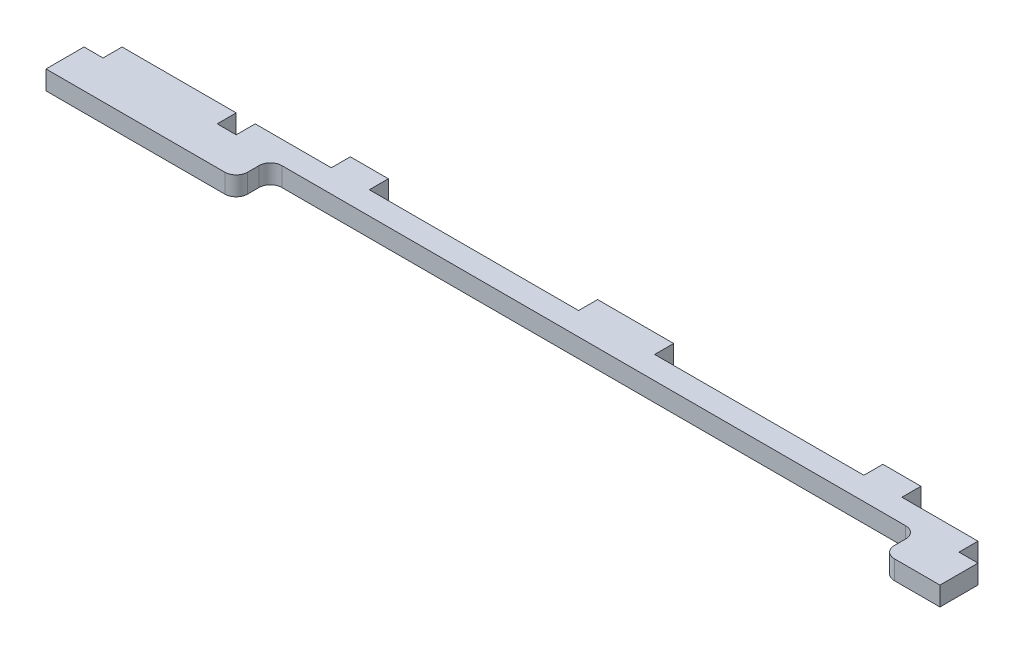
ISO-10303-21;
HEADER;
FILE_DESCRIPTION(('STEP AP214'),'2;1');
FILE_NAME('part.step','',(''),(''),'','','');
FILE_SCHEMA(('AUTOMOTIVE_DESIGN { 1 0 10303 214 1 1 1 1 }'));
ENDSEC;
DATA;
#1=APPLICATION_CONTEXT('core data for automotive mechanical design processes');
#2=APPLICATION_PROTOCOL_DEFINITION('international standard','automotive_design',2000,#1);
#3=PRODUCT_CONTEXT('',#1,'mechanical');
#4=PRODUCT('Part','Part','',(#3));
#5=PRODUCT_RELATED_PRODUCT_CATEGORY('part','',(#4));
#6=PRODUCT_DEFINITION_FORMATION('','',#4);
#7=PRODUCT_DEFINITION_CONTEXT('part definition',#1,'design');
#8=PRODUCT_DEFINITION('design','',#6,#7);
#9=PRODUCT_DEFINITION_SHAPE('','',#8);
#10=(LENGTH_UNIT() NAMED_UNIT(*) SI_UNIT(.MILLI.,.METRE.));
#11=(NAMED_UNIT(*) PLANE_ANGLE_UNIT() SI_UNIT($,.RADIAN.));
#12=(NAMED_UNIT(*) SI_UNIT($,.STERADIAN.) SOLID_ANGLE_UNIT());
#13=UNCERTAINTY_MEASURE_WITH_UNIT(LENGTH_MEASURE(1.E-05),#10,'distance_accuracy_value','');
#14=(GEOMETRIC_REPRESENTATION_CONTEXT(3) GLOBAL_UNCERTAINTY_ASSIGNED_CONTEXT((#13)) GLOBAL_UNIT_ASSIGNED_CONTEXT((#10,
#11,#12)) REPRESENTATION_CONTEXT('',''));
#15=CARTESIAN_POINT('',(0.,0.,0.));
#16=DIRECTION('',(0.,0.,1.));
#17=DIRECTION('',(1.,0.,0.));
#18=AXIS2_PLACEMENT_3D('',#15,#16,#17);
#19=CARTESIAN_POINT('',(170.,5.,-15.));
#20=DIRECTION('',(0.,0.,1.));
#21=DIRECTION('',(1.,0.,0.));
#22=AXIS2_PLACEMENT_3D('',#19,#20,#21);
#23=PLANE('',#22);
#24=DIRECTION('',(-1.,0.,0.));
#25=VECTOR('',#24,1.);
#26=CARTESIAN_POINT('',(170.,0.,-15.));
#27=LINE('',#26,#25);
#28=CARTESIAN_POINT('',(190.,0.,-15.));
#29=VERTEX_POINT('',#28);
#30=CARTESIAN_POINT('',(170.,0.,-15.));
#31=VERTEX_POINT('',#30);
#32=EDGE_CURVE('E275',#29,#31,#27,.T.);
#33=ORIENTED_EDGE('',*,*,#32,.T.);
#34=DIRECTION('',(0.,-1.,0.));
#35=VECTOR('',#34,1.);
#36=CARTESIAN_POINT('',(170.,5.,-15.));
#37=LINE('',#36,#35);
#38=CARTESIAN_POINT('',(170.,5.,-15.));
#39=VERTEX_POINT('',#38);
#40=EDGE_CURVE('E11',#39,#31,#37,.T.);
#41=ORIENTED_EDGE('',*,*,#40,.F.);
#42=DIRECTION('',(-1.,0.,0.));
#43=VECTOR('',#42,1.);
#44=CARTESIAN_POINT('',(170.,5.,-15.));
#45=LINE('',#44,#43);
#46=CARTESIAN_POINT('',(190.,5.,-15.));
#47=VERTEX_POINT('',#46);
#48=EDGE_CURVE('E338',#47,#39,#45,.T.);
#49=ORIENTED_EDGE('',*,*,#48,.F.);
#50=DIRECTION('',(0.,-1.,0.));
#51=VECTOR('',#50,1.);
#52=CARTESIAN_POINT('',(190.,5.,-15.));
#53=LINE('',#52,#51);
#54=EDGE_CURVE('E271',#47,#29,#53,.T.);
#55=ORIENTED_EDGE('',*,*,#54,.T.);
#56=EDGE_LOOP('',(#33,#41,#49,#55));
#57=FACE_BOUND('',#56,.T.);
#58=ADVANCED_FACE('F35',(#57),#23,.F.);
#59=CARTESIAN_POINT('',(170.,5.,-15.));
#60=DIRECTION('',(-1.,0.,0.));
#61=DIRECTION('',(0.,0.,1.));
#62=AXIS2_PLACEMENT_3D('',#59,#60,#61);
#63=PLANE('',#62);
#64=DIRECTION('',(0.,0.,-1.));
#65=VECTOR('',#64,1.);
#66=CARTESIAN_POINT('',(170.,0.,-15.));
#67=LINE('',#66,#65);
#68=CARTESIAN_POINT('',(170.,0.,-20.));
#69=VERTEX_POINT('',#68);
#70=EDGE_CURVE('E278',#31,#69,#67,.T.);
#71=ORIENTED_EDGE('',*,*,#70,.T.);
#72=DIRECTION('',(0.,-1.,0.));
#73=VECTOR('',#72,1.);
#74=CARTESIAN_POINT('',(170.,5.,-20.));
#75=LINE('',#74,#73);
#76=CARTESIAN_POINT('',(170.,5.,-20.));
#77=VERTEX_POINT('',#76);
#78=EDGE_CURVE('E43',#77,#69,#75,.T.);
#79=ORIENTED_EDGE('',*,*,#78,.F.);
#80=DIRECTION('',(0.,0.,-1.));
#81=VECTOR('',#80,1.);
#82=CARTESIAN_POINT('',(170.,5.,-15.));
#83=LINE('',#82,#81);
#84=EDGE_CURVE('E166',#39,#77,#83,.T.);
#85=ORIENTED_EDGE('',*,*,#84,.F.);
#86=ORIENTED_EDGE('',*,*,#40,.T.);
#87=EDGE_LOOP('',(#71,#79,#85,#86));
#88=FACE_BOUND('',#87,.T.);
#89=ADVANCED_FACE('F516',(#88),#63,.F.);
#90=CARTESIAN_POINT('',(160.,5.,-20.));
#91=DIRECTION('',(0.,0.,1.));
#92=DIRECTION('',(1.,0.,0.));
#93=AXIS2_PLACEMENT_3D('',#90,#91,#92);
#94=PLANE('',#93);
#95=DIRECTION('',(-1.,0.,0.));
#96=VECTOR('',#95,1.);
#97=CARTESIAN_POINT('',(160.,0.,-20.));
#98=LINE('',#97,#96);
#99=CARTESIAN_POINT('',(160.,0.,-20.));
#100=VERTEX_POINT('',#99);
#101=EDGE_CURVE('E280',#69,#100,#98,.T.);
#102=ORIENTED_EDGE('',*,*,#101,.T.);
#103=DIRECTION('',(0.,-1.,0.));
#104=VECTOR('',#103,1.);
#105=CARTESIAN_POINT('',(160.,5.,-20.));
#106=LINE('',#105,#104);
#107=CARTESIAN_POINT('',(160.,5.,-20.));
#108=VERTEX_POINT('',#107);
#109=EDGE_CURVE('E417',#108,#100,#106,.T.);
#110=ORIENTED_EDGE('',*,*,#109,.F.);
#111=DIRECTION('',(-1.,0.,0.));
#112=VECTOR('',#111,1.);
#113=CARTESIAN_POINT('',(160.,5.,-20.));
#114=LINE('',#113,#112);
#115=EDGE_CURVE('E425',#77,#108,#114,.T.);
#116=ORIENTED_EDGE('',*,*,#115,.F.);
#117=ORIENTED_EDGE('',*,*,#78,.T.);
#118=EDGE_LOOP('',(#102,#110,#116,#117));
#119=FACE_BOUND('',#118,.T.);
#120=ADVANCED_FACE('F423',(#119),#94,.F.);
#121=CARTESIAN_POINT('',(160.,5.,-15.));
#122=DIRECTION('',(1.,0.,0.));
#123=DIRECTION('',(0.,0.,-1.));
#124=AXIS2_PLACEMENT_3D('',#121,#122,#123);
#125=PLANE('',#124);
#126=DIRECTION('',(0.,0.,1.));
#127=VECTOR('',#126,1.);
#128=CARTESIAN_POINT('',(160.,0.,-15.));
#129=LINE('',#128,#127);
#130=CARTESIAN_POINT('',(160.,0.,-15.));
#131=VERTEX_POINT('',#130);
#132=EDGE_CURVE('E282',#100,#131,#129,.T.);
#133=ORIENTED_EDGE('',*,*,#132,.T.);
#134=DIRECTION('',(0.,-1.,0.));
#135=VECTOR('',#134,1.);
#136=CARTESIAN_POINT('',(160.,5.,-15.));
#137=LINE('',#136,#135);
#138=CARTESIAN_POINT('',(160.,5.,-15.));
#139=VERTEX_POINT('',#138);
#140=EDGE_CURVE('E414',#139,#131,#137,.T.);
#141=ORIENTED_EDGE('',*,*,#140,.F.);
#142=DIRECTION('',(0.,0.,1.));
#143=VECTOR('',#142,1.);
#144=CARTESIAN_POINT('',(160.,5.,-15.));
#145=LINE('',#144,#143);
#146=EDGE_CURVE('E443',#108,#139,#145,.T.);
#147=ORIENTED_EDGE('',*,*,#146,.F.);
#148=ORIENTED_EDGE('',*,*,#109,.T.);
#149=EDGE_LOOP('',(#133,#141,#147,#148));
#150=FACE_BOUND('',#149,.T.);
#151=ADVANCED_FACE('F434',(#150),#125,.F.);
#152=CARTESIAN_POINT('',(105.,5.,-15.));
#153=DIRECTION('',(0.,0.,1.));
#154=DIRECTION('',(1.,0.,0.));
#155=AXIS2_PLACEMENT_3D('',#152,#153,#154);
#156=PLANE('',#155);
#157=DIRECTION('',(-1.,0.,0.));
#158=VECTOR('',#157,1.);
#159=CARTESIAN_POINT('',(105.,0.,-15.));
#160=LINE('',#159,#158);
#161=CARTESIAN_POINT('',(105.,0.,-15.));
#162=VERTEX_POINT('',#161);
#163=EDGE_CURVE('E284',#131,#162,#160,.T.);
#164=ORIENTED_EDGE('',*,*,#163,.T.);
#165=DIRECTION('',(0.,-1.,0.));
#166=VECTOR('',#165,1.);
#167=CARTESIAN_POINT('',(105.,5.,-15.));
#168=LINE('',#167,#166);
#169=CARTESIAN_POINT('',(105.,5.,-15.));
#170=VERTEX_POINT('',#169);
#171=EDGE_CURVE('E411',#170,#162,#168,.T.);
#172=ORIENTED_EDGE('',*,*,#171,.F.);
#173=DIRECTION('',(-1.,0.,0.));
#174=VECTOR('',#173,1.);
#175=CARTESIAN_POINT('',(105.,5.,-15.));
#176=LINE('',#175,#174);
#177=EDGE_CURVE('E440',#139,#170,#176,.T.);
#178=ORIENTED_EDGE('',*,*,#177,.F.);
#179=ORIENTED_EDGE('',*,*,#140,.T.);
#180=EDGE_LOOP('',(#164,#172,#178,#179));
#181=FACE_BOUND('',#180,.T.);
#182=ADVANCED_FACE('F438',(#181),#156,.F.);
#183=CARTESIAN_POINT('',(105.,5.,-15.));
#184=DIRECTION('',(-1.,0.,0.));
#185=DIRECTION('',(0.,0.,1.));
#186=AXIS2_PLACEMENT_3D('',#183,#184,#185);
#187=PLANE('',#186);
#188=DIRECTION('',(0.,0.,-1.));
#189=VECTOR('',#188,1.);
#190=CARTESIAN_POINT('',(105.,0.,-15.));
#191=LINE('',#190,#189);
#192=CARTESIAN_POINT('',(105.,0.,-20.));
#193=VERTEX_POINT('',#192);
#194=EDGE_CURVE('E286',#162,#193,#191,.T.);
#195=ORIENTED_EDGE('',*,*,#194,.T.);
#196=DIRECTION('',(0.,-1.,0.));
#197=VECTOR('',#196,1.);
#198=CARTESIAN_POINT('',(105.,5.,-20.));
#199=LINE('',#198,#197);
#200=CARTESIAN_POINT('',(105.,5.,-20.));
#201=VERTEX_POINT('',#200);
#202=EDGE_CURVE('E408',#201,#193,#199,.T.);
#203=ORIENTED_EDGE('',*,*,#202,.F.);
#204=DIRECTION('',(0.,0.,-1.));
#205=VECTOR('',#204,1.);
#206=CARTESIAN_POINT('',(105.,5.,-15.));
#207=LINE('',#206,#205);
#208=EDGE_CURVE('E442',#170,#201,#207,.T.);
#209=ORIENTED_EDGE('',*,*,#208,.F.);
#210=ORIENTED_EDGE('',*,*,#171,.T.);
#211=EDGE_LOOP('',(#195,#203,#209,#210));
#212=FACE_BOUND('',#211,.T.);
#213=ADVANCED_FACE('F529',(#212),#187,.F.);
#214=CARTESIAN_POINT('',(85.,5.,-20.));
#215=DIRECTION('',(0.,0.,1.));
#216=DIRECTION('',(1.,0.,0.));
#217=AXIS2_PLACEMENT_3D('',#214,#215,#216);
#218=PLANE('',#217);
#219=DIRECTION('',(-1.,0.,0.));
#220=VECTOR('',#219,1.);
#221=CARTESIAN_POINT('',(85.,0.,-20.));
#222=LINE('',#221,#220);
#223=CARTESIAN_POINT('',(85.,0.,-20.));
#224=VERTEX_POINT('',#223);
#225=EDGE_CURVE('E288',#193,#224,#222,.T.);
#226=ORIENTED_EDGE('',*,*,#225,.T.);
#227=DIRECTION('',(0.,-1.,0.));
#228=VECTOR('',#227,1.);
#229=CARTESIAN_POINT('',(85.,5.,-20.));
#230=LINE('',#229,#228);
#231=CARTESIAN_POINT('',(85.,5.,-20.));
#232=VERTEX_POINT('',#231);
#233=EDGE_CURVE('E405',#232,#224,#230,.T.);
#234=ORIENTED_EDGE('',*,*,#233,.F.);
#235=DIRECTION('',(-1.,0.,0.));
#236=VECTOR('',#235,1.);
#237=CARTESIAN_POINT('',(85.,5.,-20.));
#238=LINE('',#237,#236);
#239=EDGE_CURVE('E445',#201,#232,#238,.T.);
#240=ORIENTED_EDGE('',*,*,#239,.F.);
#241=ORIENTED_EDGE('',*,*,#202,.T.);
#242=EDGE_LOOP('',(#226,#234,#240,#241));
#243=FACE_BOUND('',#242,.T.);
#244=ADVANCED_FACE('F532',(#243),#218,.F.);
#245=CARTESIAN_POINT('',(85.,5.,-15.));
#246=DIRECTION('',(1.,0.,0.));
#247=DIRECTION('',(0.,0.,-1.));
#248=AXIS2_PLACEMENT_3D('',#245,#246,#247);
#249=PLANE('',#248);
#250=DIRECTION('',(0.,0.,1.));
#251=VECTOR('',#250,1.);
#252=CARTESIAN_POINT('',(85.,0.,-15.));
#253=LINE('',#252,#251);
#254=CARTESIAN_POINT('',(85.,0.,-15.));
#255=VERTEX_POINT('',#254);
#256=EDGE_CURVE('E290',#224,#255,#253,.T.);
#257=ORIENTED_EDGE('',*,*,#256,.T.);
#258=DIRECTION('',(0.,-1.,0.));
#259=VECTOR('',#258,1.);
#260=CARTESIAN_POINT('',(85.,5.,-15.));
#261=LINE('',#260,#259);
#262=CARTESIAN_POINT('',(85.,5.,-15.));
#263=VERTEX_POINT('',#262);
#264=EDGE_CURVE('E402',#263,#255,#261,.T.);
#265=ORIENTED_EDGE('',*,*,#264,.F.);
#266=DIRECTION('',(0.,0.,1.));
#267=VECTOR('',#266,1.);
#268=CARTESIAN_POINT('',(85.,5.,-15.));
#269=LINE('',#268,#267);
#270=EDGE_CURVE('E451',#232,#263,#269,.T.);
#271=ORIENTED_EDGE('',*,*,#270,.F.);
#272=ORIENTED_EDGE('',*,*,#233,.T.);
#273=EDGE_LOOP('',(#257,#265,#271,#272));
#274=FACE_BOUND('',#273,.T.);
#275=ADVANCED_FACE('F536',(#274),#249,.F.);
#276=CARTESIAN_POINT('',(30.,5.,-15.));
#277=DIRECTION('',(0.,0.,1.));
#278=DIRECTION('',(1.,0.,0.));
#279=AXIS2_PLACEMENT_3D('',#276,#277,#278);
#280=PLANE('',#279);
#281=DIRECTION('',(-1.,0.,0.));
#282=VECTOR('',#281,1.);
#283=CARTESIAN_POINT('',(30.,0.,-15.));
#284=LINE('',#283,#282);
#285=CARTESIAN_POINT('',(30.,0.,-15.));
#286=VERTEX_POINT('',#285);
#287=EDGE_CURVE('E292',#255,#286,#284,.T.);
#288=ORIENTED_EDGE('',*,*,#287,.T.);
#289=DIRECTION('',(0.,-1.,0.));
#290=VECTOR('',#289,1.);
#291=CARTESIAN_POINT('',(30.,5.,-15.));
#292=LINE('',#291,#290);
#293=CARTESIAN_POINT('',(30.,5.,-15.));
#294=VERTEX_POINT('',#293);
#295=EDGE_CURVE('E399',#294,#286,#292,.T.);
#296=ORIENTED_EDGE('',*,*,#295,.F.);
#297=DIRECTION('',(-1.,0.,0.));
#298=VECTOR('',#297,1.);
#299=CARTESIAN_POINT('',(30.,5.,-15.));
#300=LINE('',#299,#298);
#301=EDGE_CURVE('E453',#263,#294,#300,.T.);
#302=ORIENTED_EDGE('',*,*,#301,.F.);
#303=ORIENTED_EDGE('',*,*,#264,.T.);
#304=EDGE_LOOP('',(#288,#296,#302,#303));
#305=FACE_BOUND('',#304,.T.);
#306=ADVANCED_FACE('F540',(#305),#280,.F.);
#307=CARTESIAN_POINT('',(30.,5.,-15.));
#308=DIRECTION('',(-1.,0.,0.));
#309=DIRECTION('',(0.,0.,1.));
#310=AXIS2_PLACEMENT_3D('',#307,#308,#309);
#311=PLANE('',#310);
#312=DIRECTION('',(0.,0.,-1.));
#313=VECTOR('',#312,1.);
#314=CARTESIAN_POINT('',(30.,0.,-15.));
#315=LINE('',#314,#313);
#316=CARTESIAN_POINT('',(30.,0.,-20.));
#317=VERTEX_POINT('',#316);
#318=EDGE_CURVE('E294',#286,#317,#315,.T.);
#319=ORIENTED_EDGE('',*,*,#318,.T.);
#320=DIRECTION('',(0.,-1.,0.));
#321=VECTOR('',#320,1.);
#322=CARTESIAN_POINT('',(30.,5.,-20.));
#323=LINE('',#322,#321);
#324=CARTESIAN_POINT('',(30.,5.,-20.));
#325=VERTEX_POINT('',#324);
#326=EDGE_CURVE('E396',#325,#317,#323,.T.);
#327=ORIENTED_EDGE('',*,*,#326,.F.);
#328=DIRECTION('',(0.,0.,-1.));
#329=VECTOR('',#328,1.);
#330=CARTESIAN_POINT('',(30.,5.,-15.));
#331=LINE('',#330,#329);
#332=EDGE_CURVE('E455',#294,#325,#331,.T.);
#333=ORIENTED_EDGE('',*,*,#332,.F.);
#334=ORIENTED_EDGE('',*,*,#295,.T.);
#335=EDGE_LOOP('',(#319,#327,#333,#334));
#336=FACE_BOUND('',#335,.T.);
#337=ADVANCED_FACE('F544',(#336),#311,.F.);
#338=CARTESIAN_POINT('',(20.,5.,-20.));
#339=DIRECTION('',(0.,0.,1.));
#340=DIRECTION('',(1.,0.,0.));
#341=AXIS2_PLACEMENT_3D('',#338,#339,#340);
#342=PLANE('',#341);
#343=DIRECTION('',(-1.,0.,0.));
#344=VECTOR('',#343,1.);
#345=CARTESIAN_POINT('',(20.,0.,-20.));
#346=LINE('',#345,#344);
#347=CARTESIAN_POINT('',(20.,0.,-20.));
#348=VERTEX_POINT('',#347);
#349=EDGE_CURVE('E296',#317,#348,#346,.T.);
#350=ORIENTED_EDGE('',*,*,#349,.T.);
#351=DIRECTION('',(0.,-1.,0.));
#352=VECTOR('',#351,1.);
#353=CARTESIAN_POINT('',(20.,5.,-20.));
#354=LINE('',#353,#352);
#355=CARTESIAN_POINT('',(20.,5.,-20.));
#356=VERTEX_POINT('',#355);
#357=EDGE_CURVE('E393',#356,#348,#354,.T.);
#358=ORIENTED_EDGE('',*,*,#357,.F.);
#359=DIRECTION('',(-1.,0.,0.));
#360=VECTOR('',#359,1.);
#361=CARTESIAN_POINT('',(20.,5.,-20.));
#362=LINE('',#361,#360);
#363=EDGE_CURVE('E457',#325,#356,#362,.T.);
#364=ORIENTED_EDGE('',*,*,#363,.F.);
#365=ORIENTED_EDGE('',*,*,#326,.T.);
#366=EDGE_LOOP('',(#350,#358,#364,#365));
#367=FACE_BOUND('',#366,.T.);
#368=ADVANCED_FACE('F548',(#367),#342,.F.);
#369=CARTESIAN_POINT('',(20.,5.,-15.));
#370=DIRECTION('',(1.,0.,0.));
#371=DIRECTION('',(0.,0.,-1.));
#372=AXIS2_PLACEMENT_3D('',#369,#370,#371);
#373=PLANE('',#372);
#374=DIRECTION('',(0.,0.,1.));
#375=VECTOR('',#374,1.);
#376=CARTESIAN_POINT('',(20.,0.,-15.));
#377=LINE('',#376,#375);
#378=CARTESIAN_POINT('',(20.,0.,-15.));
#379=VERTEX_POINT('',#378);
#380=EDGE_CURVE('E298',#348,#379,#377,.T.);
#381=ORIENTED_EDGE('',*,*,#380,.T.);
#382=DIRECTION('',(0.,-1.,0.));
#383=VECTOR('',#382,1.);
#384=CARTESIAN_POINT('',(20.,5.,-15.));
#385=LINE('',#384,#383);
#386=CARTESIAN_POINT('',(20.,5.,-15.));
#387=VERTEX_POINT('',#386);
#388=EDGE_CURVE('E390',#387,#379,#385,.T.);
#389=ORIENTED_EDGE('',*,*,#388,.F.);
#390=DIRECTION('',(0.,0.,1.));
#391=VECTOR('',#390,1.);
#392=CARTESIAN_POINT('',(20.,5.,-15.));
#393=LINE('',#392,#391);
#394=EDGE_CURVE('E459',#356,#387,#393,.T.);
#395=ORIENTED_EDGE('',*,*,#394,.F.);
#396=ORIENTED_EDGE('',*,*,#357,.T.);
#397=EDGE_LOOP('',(#381,#389,#395,#396));
#398=FACE_BOUND('',#397,.T.);
#399=ADVANCED_FACE('F552',(#398),#373,.F.);
#400=CARTESIAN_POINT('',(0.,5.,-15.));
#401=DIRECTION('',(0.,0.,1.));
#402=DIRECTION('',(1.,0.,0.));
#403=AXIS2_PLACEMENT_3D('',#400,#401,#402);
#404=PLANE('',#403);
#405=DIRECTION('',(-1.,0.,0.));
#406=VECTOR('',#405,1.);
#407=CARTESIAN_POINT('',(0.,0.,-15.));
#408=LINE('',#407,#406);
#409=CARTESIAN_POINT('',(0.,0.,-15.));
#410=VERTEX_POINT('',#409);
#411=EDGE_CURVE('E300',#379,#410,#408,.T.);
#412=ORIENTED_EDGE('',*,*,#411,.T.);
#413=DIRECTION('',(0.,-1.,0.));
#414=VECTOR('',#413,1.);
#415=CARTESIAN_POINT('',(0.,5.,-15.));
#416=LINE('',#415,#414);
#417=CARTESIAN_POINT('',(0.,5.,-15.));
#418=VERTEX_POINT('',#417);
#419=EDGE_CURVE('E387',#418,#410,#416,.T.);
#420=ORIENTED_EDGE('',*,*,#419,.F.);
#421=DIRECTION('',(-1.,0.,0.));
#422=VECTOR('',#421,1.);
#423=CARTESIAN_POINT('',(0.,5.,-15.));
#424=LINE('',#423,#422);
#425=EDGE_CURVE('E461',#387,#418,#424,.T.);
#426=ORIENTED_EDGE('',*,*,#425,.F.);
#427=ORIENTED_EDGE('',*,*,#388,.T.);
#428=EDGE_LOOP('',(#412,#420,#426,#427));
#429=FACE_BOUND('',#428,.T.);
#430=ADVANCED_FACE('F556',(#429),#404,.F.);
#431=CARTESIAN_POINT('',(0.,5.,-10.));
#432=DIRECTION('',(1.,0.,0.));
#433=DIRECTION('',(0.,0.,-1.));
#434=AXIS2_PLACEMENT_3D('',#431,#432,#433);
#435=PLANE('',#434);
#436=DIRECTION('',(0.,0.,1.));
#437=VECTOR('',#436,1.);
#438=CARTESIAN_POINT('',(0.,0.,-10.));
#439=LINE('',#438,#437);
#440=CARTESIAN_POINT('',(0.,0.,-10.));
#441=VERTEX_POINT('',#440);
#442=EDGE_CURVE('E302',#410,#441,#439,.T.);
#443=ORIENTED_EDGE('',*,*,#442,.T.);
#444=DIRECTION('',(0.,-1.,0.));
#445=VECTOR('',#444,1.);
#446=CARTESIAN_POINT('',(0.,5.,-10.));
#447=LINE('',#446,#445);
#448=CARTESIAN_POINT('',(0.,5.,-10.));
#449=VERTEX_POINT('',#448);
#450=EDGE_CURVE('E384',#449,#441,#447,.T.);
#451=ORIENTED_EDGE('',*,*,#450,.F.);
#452=DIRECTION('',(0.,0.,1.));
#453=VECTOR('',#452,1.);
#454=CARTESIAN_POINT('',(0.,5.,-10.));
#455=LINE('',#454,#453);
#456=EDGE_CURVE('E463',#418,#449,#455,.T.);
#457=ORIENTED_EDGE('',*,*,#456,.F.);
#458=ORIENTED_EDGE('',*,*,#419,.T.);
#459=EDGE_LOOP('',(#443,#451,#457,#458));
#460=FACE_BOUND('',#459,.T.);
#461=ADVANCED_FACE('F560',(#460),#435,.F.);
#462=CARTESIAN_POINT('',(0.,5.,-10.));
#463=DIRECTION('',(0.,0.,1.));
#464=DIRECTION('',(1.,0.,0.));
#465=AXIS2_PLACEMENT_3D('',#462,#463,#464);
#466=PLANE('',#465);
#467=DIRECTION('',(-1.,0.,0.));
#468=VECTOR('',#467,1.);
#469=CARTESIAN_POINT('',(0.,0.,-10.));
#470=LINE('',#469,#468);
#471=CARTESIAN_POINT('',(-5.,0.,-10.));
#472=VERTEX_POINT('',#471);
#473=EDGE_CURVE('E304',#441,#472,#470,.T.);
#474=ORIENTED_EDGE('',*,*,#473,.T.);
#475=DIRECTION('',(0.,-1.,0.));
#476=VECTOR('',#475,1.);
#477=CARTESIAN_POINT('',(-5.,5.,-10.));
#478=LINE('',#477,#476);
#479=CARTESIAN_POINT('',(-5.,5.,-10.));
#480=VERTEX_POINT('',#479);
#481=EDGE_CURVE('E381',#480,#472,#478,.T.);
#482=ORIENTED_EDGE('',*,*,#481,.F.);
#483=DIRECTION('',(-1.,0.,0.));
#484=VECTOR('',#483,1.);
#485=CARTESIAN_POINT('',(0.,5.,-10.));
#486=LINE('',#485,#484);
#487=EDGE_CURVE('E465',#449,#480,#486,.T.);
#488=ORIENTED_EDGE('',*,*,#487,.F.);
#489=ORIENTED_EDGE('',*,*,#450,.T.);
#490=EDGE_LOOP('',(#474,#482,#488,#489));
#491=FACE_BOUND('',#490,.T.);
#492=ADVANCED_FACE('F564',(#491),#466,.F.);
#493=CARTESIAN_POINT('',(-5.,5.,-15.));
#494=DIRECTION('',(-1.,0.,0.));
#495=DIRECTION('',(0.,0.,1.));
#496=AXIS2_PLACEMENT_3D('',#493,#494,#495);
#497=PLANE('',#496);
#498=DIRECTION('',(0.,0.,-1.));
#499=VECTOR('',#498,1.);
#500=CARTESIAN_POINT('',(-5.,0.,-15.));
#501=LINE('',#500,#499);
#502=CARTESIAN_POINT('',(-5.,0.,-15.));
#503=VERTEX_POINT('',#502);
#504=EDGE_CURVE('E306',#472,#503,#501,.T.);
#505=ORIENTED_EDGE('',*,*,#504,.T.);
#506=DIRECTION('',(0.,-1.,0.));
#507=VECTOR('',#506,1.);
#508=CARTESIAN_POINT('',(-5.,5.,-15.));
#509=LINE('',#508,#507);
#510=CARTESIAN_POINT('',(-5.,5.,-15.));
#511=VERTEX_POINT('',#510);
#512=EDGE_CURVE('E378',#511,#503,#509,.T.);
#513=ORIENTED_EDGE('',*,*,#512,.F.);
#514=DIRECTION('',(0.,0.,-1.));
#515=VECTOR('',#514,1.);
#516=CARTESIAN_POINT('',(-5.,5.,-15.));
#517=LINE('',#516,#515);
#518=EDGE_CURVE('E467',#480,#511,#517,.T.);
#519=ORIENTED_EDGE('',*,*,#518,.F.);
#520=ORIENTED_EDGE('',*,*,#481,.T.);
#521=EDGE_LOOP('',(#505,#513,#519,#520));
#522=FACE_BOUND('',#521,.T.);
#523=ADVANCED_FACE('F568',(#522),#497,.F.);
#524=CARTESIAN_POINT('',(-35.,5.,-15.));
#525=DIRECTION('',(0.,0.,1.));
#526=DIRECTION('',(1.,0.,0.));
#527=AXIS2_PLACEMENT_3D('',#524,#525,#526);
#528=PLANE('',#527);
#529=DIRECTION('',(-1.,0.,0.));
#530=VECTOR('',#529,1.);
#531=CARTESIAN_POINT('',(-35.,0.,-15.));
#532=LINE('',#531,#530);
#533=CARTESIAN_POINT('',(-35.,0.,-15.));
#534=VERTEX_POINT('',#533);
#535=EDGE_CURVE('E308',#503,#534,#532,.T.);
#536=ORIENTED_EDGE('',*,*,#535,.T.);
#537=DIRECTION('',(0.,-1.,0.));
#538=VECTOR('',#537,1.);
#539=CARTESIAN_POINT('',(-35.,5.,-15.));
#540=LINE('',#539,#538);
#541=CARTESIAN_POINT('',(-35.,5.,-15.));
#542=VERTEX_POINT('',#541);
#543=EDGE_CURVE('E375',#542,#534,#540,.T.);
#544=ORIENTED_EDGE('',*,*,#543,.F.);
#545=DIRECTION('',(-1.,0.,0.));
#546=VECTOR('',#545,1.);
#547=CARTESIAN_POINT('',(-35.,5.,-15.));
#548=LINE('',#547,#546);
#549=EDGE_CURVE('E469',#511,#542,#548,.T.);
#550=ORIENTED_EDGE('',*,*,#549,.F.);
#551=ORIENTED_EDGE('',*,*,#512,.T.);
#552=EDGE_LOOP('',(#536,#544,#550,#551));
#553=FACE_BOUND('',#552,.T.);
#554=ADVANCED_FACE('F572',(#553),#528,.F.);
#555=CARTESIAN_POINT('',(-35.,5.,-10.));
#556=DIRECTION('',(1.,0.,0.));
#557=DIRECTION('',(0.,0.,-1.));
#558=AXIS2_PLACEMENT_3D('',#555,#556,#557);
#559=PLANE('',#558);
#560=DIRECTION('',(0.,0.,1.));
#561=VECTOR('',#560,1.);
#562=CARTESIAN_POINT('',(-35.,0.,-10.));
#563=LINE('',#562,#561);
#564=CARTESIAN_POINT('',(-35.,0.,-10.));
#565=VERTEX_POINT('',#564);
#566=EDGE_CURVE('E310',#534,#565,#563,.T.);
#567=ORIENTED_EDGE('',*,*,#566,.T.);
#568=DIRECTION('',(0.,-1.,0.));
#569=VECTOR('',#568,1.);
#570=CARTESIAN_POINT('',(-35.,5.,-10.));
#571=LINE('',#570,#569);
#572=CARTESIAN_POINT('',(-35.,5.,-10.));
#573=VERTEX_POINT('',#572);
#574=EDGE_CURVE('E372',#573,#565,#571,.T.);
#575=ORIENTED_EDGE('',*,*,#574,.F.);
#576=DIRECTION('',(0.,0.,1.));
#577=VECTOR('',#576,1.);
#578=CARTESIAN_POINT('',(-35.,5.,-10.));
#579=LINE('',#578,#577);
#580=EDGE_CURVE('E471',#542,#573,#579,.T.);
#581=ORIENTED_EDGE('',*,*,#580,.F.);
#582=ORIENTED_EDGE('',*,*,#543,.T.);
#583=EDGE_LOOP('',(#567,#575,#581,#582));
#584=FACE_BOUND('',#583,.T.);
#585=ADVANCED_FACE('F576',(#584),#559,.F.);
#586=CARTESIAN_POINT('',(-40.,5.,-10.));
#587=DIRECTION('',(0.,0.,1.));
#588=DIRECTION('',(1.,0.,0.));
#589=AXIS2_PLACEMENT_3D('',#586,#587,#588);
#590=PLANE('',#589);
#591=DIRECTION('',(-1.,0.,0.));
#592=VECTOR('',#591,1.);
#593=CARTESIAN_POINT('',(-40.,0.,-10.));
#594=LINE('',#593,#592);
#595=CARTESIAN_POINT('',(-40.,0.,-10.));
#596=VERTEX_POINT('',#595);
#597=EDGE_CURVE('E312',#565,#596,#594,.T.);
#598=ORIENTED_EDGE('',*,*,#597,.T.);
#599=DIRECTION('',(0.,-1.,0.));
#600=VECTOR('',#599,1.);
#601=CARTESIAN_POINT('',(-40.,5.,-10.));
#602=LINE('',#601,#600);
#603=CARTESIAN_POINT('',(-40.,5.,-10.));
#604=VERTEX_POINT('',#603);
#605=EDGE_CURVE('E369',#604,#596,#602,.T.);
#606=ORIENTED_EDGE('',*,*,#605,.F.);
#607=DIRECTION('',(-1.,0.,0.));
#608=VECTOR('',#607,1.);
#609=CARTESIAN_POINT('',(-40.,5.,-10.));
#610=LINE('',#609,#608);
#611=EDGE_CURVE('E473',#573,#604,#610,.T.);
#612=ORIENTED_EDGE('',*,*,#611,.F.);
#613=ORIENTED_EDGE('',*,*,#574,.T.);
#614=EDGE_LOOP('',(#598,#606,#612,#613));
#615=FACE_BOUND('',#614,.T.);
#616=ADVANCED_FACE('F580',(#615),#590,.F.);
#617=CARTESIAN_POINT('',(-40.,5.,0.));
#618=DIRECTION('',(1.,0.,0.));
#619=DIRECTION('',(0.,0.,-1.));
#620=AXIS2_PLACEMENT_3D('',#617,#618,#619);
#621=PLANE('',#620);
#622=DIRECTION('',(0.,0.,1.));
#623=VECTOR('',#622,1.);
#624=CARTESIAN_POINT('',(-40.,0.,0.));
#625=LINE('',#624,#623);
#626=CARTESIAN_POINT('',(-40.,0.,0.));
#627=VERTEX_POINT('',#626);
#628=EDGE_CURVE('E314',#596,#627,#625,.T.);
#629=ORIENTED_EDGE('',*,*,#628,.T.);
#630=DIRECTION('',(0.,-1.,0.));
#631=VECTOR('',#630,1.);
#632=CARTESIAN_POINT('',(-40.,5.,0.));
#633=LINE('',#632,#631);
#634=CARTESIAN_POINT('',(-40.,5.,0.));
#635=VERTEX_POINT('',#634);
#636=EDGE_CURVE('E366',#635,#627,#633,.T.);
#637=ORIENTED_EDGE('',*,*,#636,.F.);
#638=DIRECTION('',(0.,0.,1.));
#639=VECTOR('',#638,1.);
#640=CARTESIAN_POINT('',(-40.,5.,0.));
#641=LINE('',#640,#639);
#642=EDGE_CURVE('E475',#604,#635,#641,.T.);
#643=ORIENTED_EDGE('',*,*,#642,.F.);
#644=ORIENTED_EDGE('',*,*,#605,.T.);
#645=EDGE_LOOP('',(#629,#637,#643,#644));
#646=FACE_BOUND('',#645,.T.);
#647=ADVANCED_FACE('F584',(#646),#621,.F.);
#648=CARTESIAN_POINT('',(-5.,5.,0.));
#649=DIRECTION('',(0.,0.,-1.));
#650=DIRECTION('',(-1.,0.,0.));
#651=AXIS2_PLACEMENT_3D('',#648,#649,#650);
#652=PLANE('',#651);
#653=DIRECTION('',(1.,0.,0.));
#654=VECTOR('',#653,1.);
#655=CARTESIAN_POINT('',(-5.,0.,0.));
#656=LINE('',#655,#654);
#657=CARTESIAN_POINT('',(6.99999999999998,0.,0.));
#658=VERTEX_POINT('',#657);
#659=EDGE_CURVE('E317',#627,#658,#656,.T.);
#660=ORIENTED_EDGE('',*,*,#659,.T.);
#661=DIRECTION('',(0.,-1.,0.));
#662=VECTOR('',#661,1.);
#663=CARTESIAN_POINT('',(6.99999999999998,5.,0.));
#664=LINE('',#663,#662);
#665=CARTESIAN_POINT('',(6.99999999999998,5.,0.));
#666=VERTEX_POINT('',#665);
#667=EDGE_CURVE('E363',#666,#658,#664,.T.);
#668=ORIENTED_EDGE('',*,*,#667,.F.);
#669=DIRECTION('',(1.,0.,0.));
#670=VECTOR('',#669,1.);
#671=CARTESIAN_POINT('',(-5.,5.,0.));
#672=LINE('',#671,#670);
#673=EDGE_CURVE('E477',#635,#666,#672,.T.);
#674=ORIENTED_EDGE('',*,*,#673,.F.);
#675=ORIENTED_EDGE('',*,*,#636,.T.);
#676=EDGE_LOOP('',(#660,#668,#674,#675));
#677=FACE_BOUND('',#676,.T.);
#678=ADVANCED_FACE('F588',(#677),#652,.F.);
#679=CARTESIAN_POINT('',(7.,5.,-3.));
#680=DIRECTION('',(0.,-1.,0.));
#681=DIRECTION('',(0.,0.,-1.));
#682=AXIS2_PLACEMENT_3D('',#679,#680,#681);
#683=CYLINDRICAL_SURFACE('',#682,3.);
#684=CARTESIAN_POINT('',(7.,0.,-3.));
#685=DIRECTION('',(0.,1.,0.));
#686=DIRECTION('',(0.,0.,-1.));
#687=AXIS2_PLACEMENT_3D('',#684,#685,#686);
#688=CIRCLE('',#687,3.);
#689=CARTESIAN_POINT('',(10.,0.,-3.00000000000002));
#690=VERTEX_POINT('',#689);
#691=EDGE_CURVE('E319',#658,#690,#688,.T.);
#692=ORIENTED_EDGE('',*,*,#691,.T.);
#693=DIRECTION('',(0.,-1.,0.));
#694=VECTOR('',#693,1.);
#695=CARTESIAN_POINT('',(10.,5.,-3.00000000000002));
#696=LINE('',#695,#694);
#697=CARTESIAN_POINT('',(10.,5.,-3.00000000000002));
#698=VERTEX_POINT('',#697);
#699=EDGE_CURVE('E360',#698,#690,#696,.T.);
#700=ORIENTED_EDGE('',*,*,#699,.F.);
#701=CARTESIAN_POINT('',(7.,5.,-3.));
#702=DIRECTION('',(0.,1.,0.));
#703=DIRECTION('',(0.,0.,-1.));
#704=AXIS2_PLACEMENT_3D('',#701,#702,#703);
#705=CIRCLE('',#704,3.);
#706=EDGE_CURVE('E479',#666,#698,#705,.T.);
#707=ORIENTED_EDGE('',*,*,#706,.F.);
#708=ORIENTED_EDGE('',*,*,#667,.T.);
#709=EDGE_LOOP('',(#692,#700,#707,#708));
#710=FACE_BOUND('',#709,.T.);
#711=ADVANCED_FACE('F592',(#710),#683,.T.);
#712=CARTESIAN_POINT('',(10.,5.,-3.00000000000002));
#713=DIRECTION('',(-1.,0.,0.));
#714=DIRECTION('',(0.,0.,1.));
#715=AXIS2_PLACEMENT_3D('',#712,#713,#714);
#716=PLANE('',#715);
#717=DIRECTION('',(0.,0.,-1.));
#718=VECTOR('',#717,1.);
#719=CARTESIAN_POINT('',(10.,0.,-3.00000000000002));
#720=LINE('',#719,#718);
#721=CARTESIAN_POINT('',(10.,0.,-6.));
#722=VERTEX_POINT('',#721);
#723=EDGE_CURVE('E321',#690,#722,#720,.T.);
#724=ORIENTED_EDGE('',*,*,#723,.T.);
#725=DIRECTION('',(0.,-1.,0.));
#726=VECTOR('',#725,1.);
#727=CARTESIAN_POINT('',(10.,5.,-6.));
#728=LINE('',#727,#726);
#729=CARTESIAN_POINT('',(10.,5.,-6.));
#730=VERTEX_POINT('',#729);
#731=EDGE_CURVE('E357',#730,#722,#728,.T.);
#732=ORIENTED_EDGE('',*,*,#731,.F.);
#733=DIRECTION('',(0.,0.,-1.));
#734=VECTOR('',#733,1.);
#735=CARTESIAN_POINT('',(10.,5.,-3.00000000000002));
#736=LINE('',#735,#734);
#737=EDGE_CURVE('E481',#698,#730,#736,.T.);
#738=ORIENTED_EDGE('',*,*,#737,.F.);
#739=ORIENTED_EDGE('',*,*,#699,.T.);
#740=EDGE_LOOP('',(#724,#732,#738,#739));
#741=FACE_BOUND('',#740,.T.);
#742=ADVANCED_FACE('F596',(#741),#716,.F.);
#743=CARTESIAN_POINT('',(13.,5.,-6.));
#744=DIRECTION('',(0.,-1.,0.));
#745=DIRECTION('',(0.,0.,-1.));
#746=AXIS2_PLACEMENT_3D('',#743,#744,#745);
#747=CYLINDRICAL_SURFACE('',#746,3.);
#748=CARTESIAN_POINT('',(13.,0.,-6.));
#749=DIRECTION('',(0.,-1.,0.));
#750=DIRECTION('',(0.,0.,-1.));
#751=AXIS2_PLACEMENT_3D('',#748,#749,#750);
#752=CIRCLE('',#751,3.);
#753=CARTESIAN_POINT('',(13.,0.,-9.));
#754=VERTEX_POINT('',#753);
#755=EDGE_CURVE('E323',#722,#754,#752,.T.);
#756=ORIENTED_EDGE('',*,*,#755,.T.);
#757=DIRECTION('',(0.,-1.,0.));
#758=VECTOR('',#757,1.);
#759=CARTESIAN_POINT('',(13.,5.,-9.));
#760=LINE('',#759,#758);
#761=CARTESIAN_POINT('',(13.,5.,-9.));
#762=VERTEX_POINT('',#761);
#763=EDGE_CURVE('E354',#762,#754,#760,.T.);
#764=ORIENTED_EDGE('',*,*,#763,.F.);
#765=CARTESIAN_POINT('',(13.,5.,-6.));
#766=DIRECTION('',(0.,-1.,0.));
#767=DIRECTION('',(0.,0.,-1.));
#768=AXIS2_PLACEMENT_3D('',#765,#766,#767);
#769=CIRCLE('',#768,3.);
#770=EDGE_CURVE('E483',#730,#762,#769,.T.);
#771=ORIENTED_EDGE('',*,*,#770,.F.);
#772=ORIENTED_EDGE('',*,*,#731,.T.);
#773=EDGE_LOOP('',(#756,#764,#771,#772));
#774=FACE_BOUND('',#773,.T.);
#775=ADVANCED_FACE('F600',(#774),#747,.F.);
#776=CARTESIAN_POINT('',(13.,5.,-9.));
#777=DIRECTION('',(0.,0.,-1.));
#778=DIRECTION('',(-1.,0.,0.));
#779=AXIS2_PLACEMENT_3D('',#776,#777,#778);
#780=PLANE('',#779);
#781=DIRECTION('',(1.,0.,0.));
#782=VECTOR('',#781,1.);
#783=CARTESIAN_POINT('',(13.,0.,-9.));
#784=LINE('',#783,#782);
#785=CARTESIAN_POINT('',(177.,0.,-9.));
#786=VERTEX_POINT('',#785);
#787=EDGE_CURVE('E325',#754,#786,#784,.T.);
#788=ORIENTED_EDGE('',*,*,#787,.T.);
#789=DIRECTION('',(0.,-1.,0.));
#790=VECTOR('',#789,1.);
#791=CARTESIAN_POINT('',(177.,5.,-9.));
#792=LINE('',#791,#790);
#793=CARTESIAN_POINT('',(177.,5.,-9.));
#794=VERTEX_POINT('',#793);
#795=EDGE_CURVE('E351',#794,#786,#792,.T.);
#796=ORIENTED_EDGE('',*,*,#795,.F.);
#797=DIRECTION('',(1.,0.,0.));
#798=VECTOR('',#797,1.);
#799=CARTESIAN_POINT('',(13.,5.,-9.));
#800=LINE('',#799,#798);
#801=EDGE_CURVE('E485',#762,#794,#800,.T.);
#802=ORIENTED_EDGE('',*,*,#801,.F.);
#803=ORIENTED_EDGE('',*,*,#763,.T.);
#804=EDGE_LOOP('',(#788,#796,#802,#803));
#805=FACE_BOUND('',#804,.T.);
#806=ADVANCED_FACE('F604',(#805),#780,.F.);
#807=CARTESIAN_POINT('',(177.,5.,-6.));
#808=DIRECTION('',(0.,-1.,0.));
#809=DIRECTION('',(0.,0.,-1.));
#810=AXIS2_PLACEMENT_3D('',#807,#808,#809);
#811=CYLINDRICAL_SURFACE('',#810,3.);
#812=CARTESIAN_POINT('',(177.,0.,-6.));
#813=DIRECTION('',(0.,-1.,0.));
#814=DIRECTION('',(0.,0.,-1.));
#815=AXIS2_PLACEMENT_3D('',#812,#813,#814);
#816=CIRCLE('',#815,3.);
#817=CARTESIAN_POINT('',(180.,0.,-6.));
#818=VERTEX_POINT('',#817);
#819=EDGE_CURVE('E327',#786,#818,#816,.T.);
#820=ORIENTED_EDGE('',*,*,#819,.T.);
#821=DIRECTION('',(0.,-1.,0.));
#822=VECTOR('',#821,1.);
#823=CARTESIAN_POINT('',(180.,5.,-6.));
#824=LINE('',#823,#822);
#825=CARTESIAN_POINT('',(180.,5.,-6.));
#826=VERTEX_POINT('',#825);
#827=EDGE_CURVE('E348',#826,#818,#824,.T.);
#828=ORIENTED_EDGE('',*,*,#827,.F.);
#829=CARTESIAN_POINT('',(177.,5.,-6.));
#830=DIRECTION('',(0.,-1.,0.));
#831=DIRECTION('',(0.,0.,-1.));
#832=AXIS2_PLACEMENT_3D('',#829,#830,#831);
#833=CIRCLE('',#832,3.);
#834=EDGE_CURVE('E487',#794,#826,#833,.T.);
#835=ORIENTED_EDGE('',*,*,#834,.F.);
#836=ORIENTED_EDGE('',*,*,#795,.T.);
#837=EDGE_LOOP('',(#820,#828,#835,#836));
#838=FACE_BOUND('',#837,.T.);
#839=ADVANCED_FACE('F608',(#838),#811,.F.);
#840=CARTESIAN_POINT('',(180.,5.,-6.));
#841=DIRECTION('',(1.,0.,0.));
#842=DIRECTION('',(0.,0.,-1.));
#843=AXIS2_PLACEMENT_3D('',#840,#841,#842);
#844=PLANE('',#843);
#845=DIRECTION('',(0.,0.,1.));
#846=VECTOR('',#845,1.);
#847=CARTESIAN_POINT('',(180.,0.,-6.));
#848=LINE('',#847,#846);
#849=CARTESIAN_POINT('',(180.,0.,-3.00000000000002));
#850=VERTEX_POINT('',#849);
#851=EDGE_CURVE('E329',#818,#850,#848,.T.);
#852=ORIENTED_EDGE('',*,*,#851,.T.);
#853=DIRECTION('',(0.,-1.,0.));
#854=VECTOR('',#853,1.);
#855=CARTESIAN_POINT('',(180.,5.,-3.00000000000002));
#856=LINE('',#855,#854);
#857=CARTESIAN_POINT('',(180.,5.,-3.00000000000002));
#858=VERTEX_POINT('',#857);
#859=EDGE_CURVE('E345',#858,#850,#856,.T.);
#860=ORIENTED_EDGE('',*,*,#859,.F.);
#861=DIRECTION('',(0.,0.,1.));
#862=VECTOR('',#861,1.);
#863=CARTESIAN_POINT('',(180.,5.,-6.));
#864=LINE('',#863,#862);
#865=EDGE_CURVE('E489',#826,#858,#864,.T.);
#866=ORIENTED_EDGE('',*,*,#865,.F.);
#867=ORIENTED_EDGE('',*,*,#827,.T.);
#868=EDGE_LOOP('',(#852,#860,#866,#867));
#869=FACE_BOUND('',#868,.T.);
#870=ADVANCED_FACE('F612',(#869),#844,.F.);
#871=CARTESIAN_POINT('',(183.,5.,-3.));
#872=DIRECTION('',(0.,-1.,0.));
#873=DIRECTION('',(0.,0.,-1.));
#874=AXIS2_PLACEMENT_3D('',#871,#872,#873);
#875=CYLINDRICAL_SURFACE('',#874,3.);
#876=CARTESIAN_POINT('',(183.,0.,-3.));
#877=DIRECTION('',(0.,1.,0.));
#878=DIRECTION('',(0.,0.,1.));
#879=AXIS2_PLACEMENT_3D('',#876,#877,#878);
#880=CIRCLE('',#879,3.);
#881=CARTESIAN_POINT('',(183.,0.,0.));
#882=VERTEX_POINT('',#881);
#883=EDGE_CURVE('E331',#850,#882,#880,.T.);
#884=ORIENTED_EDGE('',*,*,#883,.T.);
#885=DIRECTION('',(0.,-1.,0.));
#886=VECTOR('',#885,1.);
#887=CARTESIAN_POINT('',(183.,5.,0.));
#888=LINE('',#887,#886);
#889=CARTESIAN_POINT('',(183.,5.,0.));
#890=VERTEX_POINT('',#889);
#891=EDGE_CURVE('E342',#890,#882,#888,.T.);
#892=ORIENTED_EDGE('',*,*,#891,.F.);
#893=CARTESIAN_POINT('',(183.,5.,-3.));
#894=DIRECTION('',(0.,1.,0.));
#895=DIRECTION('',(0.,0.,1.));
#896=AXIS2_PLACEMENT_3D('',#893,#894,#895);
#897=CIRCLE('',#896,3.);
#898=EDGE_CURVE('E491',#858,#890,#897,.T.);
#899=ORIENTED_EDGE('',*,*,#898,.F.);
#900=ORIENTED_EDGE('',*,*,#859,.T.);
#901=EDGE_LOOP('',(#884,#892,#899,#900));
#902=FACE_BOUND('',#901,.T.);
#903=ADVANCED_FACE('F497',(#902),#875,.T.);
#904=CARTESIAN_POINT('',(183.,5.,0.));
#905=DIRECTION('',(0.,0.,-1.));
#906=DIRECTION('',(-1.,0.,0.));
#907=AXIS2_PLACEMENT_3D('',#904,#905,#906);
#908=PLANE('',#907);
#909=DIRECTION('',(1.,0.,0.));
#910=VECTOR('',#909,1.);
#911=CARTESIAN_POINT('',(183.,0.,0.));
#912=LINE('',#911,#910);
#913=CARTESIAN_POINT('',(195.,0.,0.));
#914=VERTEX_POINT('',#913);
#915=EDGE_CURVE('E333',#882,#914,#912,.T.);
#916=ORIENTED_EDGE('',*,*,#915,.T.);
#917=DIRECTION('',(0.,-1.,0.));
#918=VECTOR('',#917,1.);
#919=CARTESIAN_POINT('',(195.,5.,0.));
#920=LINE('',#919,#918);
#921=CARTESIAN_POINT('',(195.,5.,0.));
#922=VERTEX_POINT('',#921);
#923=EDGE_CURVE('E266',#922,#914,#920,.T.);
#924=ORIENTED_EDGE('',*,*,#923,.F.);
#925=DIRECTION('',(1.,0.,0.));
#926=VECTOR('',#925,1.);
#927=CARTESIAN_POINT('',(183.,5.,0.));
#928=LINE('',#927,#926);
#929=EDGE_CURVE('E257',#890,#922,#928,.T.);
#930=ORIENTED_EDGE('',*,*,#929,.F.);
#931=ORIENTED_EDGE('',*,*,#891,.T.);
#932=EDGE_LOOP('',(#916,#924,#930,#931));
#933=FACE_BOUND('',#932,.T.);
#934=ADVANCED_FACE('F501',(#933),#908,.F.);
#935=CARTESIAN_POINT('',(195.,5.,-10.));
#936=DIRECTION('',(-1.,0.,0.));
#937=DIRECTION('',(0.,0.,1.));
#938=AXIS2_PLACEMENT_3D('',#935,#936,#937);
#939=PLANE('',#938);
#940=DIRECTION('',(0.,0.,-1.));
#941=VECTOR('',#940,1.);
#942=CARTESIAN_POINT('',(195.,0.,-10.));
#943=LINE('',#942,#941);
#944=CARTESIAN_POINT('',(195.,0.,-10.));
#945=VERTEX_POINT('',#944);
#946=EDGE_CURVE('E265',#914,#945,#943,.T.);
#947=ORIENTED_EDGE('',*,*,#946,.T.);
#948=DIRECTION('',(0.,-1.,0.));
#949=VECTOR('',#948,1.);
#950=CARTESIAN_POINT('',(195.,5.,-10.));
#951=LINE('',#950,#949);
#952=CARTESIAN_POINT('',(195.,5.,-10.));
#953=VERTEX_POINT('',#952);
#954=EDGE_CURVE('E262',#953,#945,#951,.T.);
#955=ORIENTED_EDGE('',*,*,#954,.F.);
#956=DIRECTION('',(0.,0.,-1.));
#957=VECTOR('',#956,1.);
#958=CARTESIAN_POINT('',(195.,5.,-10.));
#959=LINE('',#958,#957);
#960=EDGE_CURVE('E251',#922,#953,#959,.T.);
#961=ORIENTED_EDGE('',*,*,#960,.F.);
#962=ORIENTED_EDGE('',*,*,#923,.T.);
#963=EDGE_LOOP('',(#947,#955,#961,#962));
#964=FACE_BOUND('',#963,.T.);
#965=ADVANCED_FACE('F263',(#964),#939,.F.);
#966=CARTESIAN_POINT('',(190.,5.,-10.));
#967=DIRECTION('',(0.,0.,1.));
#968=DIRECTION('',(1.,0.,0.));
#969=AXIS2_PLACEMENT_3D('',#966,#967,#968);
#970=PLANE('',#969);
#971=DIRECTION('',(-1.,0.,0.));
#972=VECTOR('',#971,1.);
#973=CARTESIAN_POINT('',(190.,0.,-10.));
#974=LINE('',#973,#972);
#975=CARTESIAN_POINT('',(190.,0.,-10.));
#976=VERTEX_POINT('',#975);
#977=EDGE_CURVE('E152',#945,#976,#974,.T.);
#978=ORIENTED_EDGE('',*,*,#977,.T.);
#979=DIRECTION('',(0.,-1.,0.));
#980=VECTOR('',#979,1.);
#981=CARTESIAN_POINT('',(190.,5.,-10.));
#982=LINE('',#981,#980);
#983=CARTESIAN_POINT('',(190.,5.,-10.));
#984=VERTEX_POINT('',#983);
#985=EDGE_CURVE('E267',#984,#976,#982,.T.);
#986=ORIENTED_EDGE('',*,*,#985,.F.);
#987=DIRECTION('',(-1.,0.,0.));
#988=VECTOR('',#987,1.);
#989=CARTESIAN_POINT('',(190.,5.,-10.));
#990=LINE('',#989,#988);
#991=EDGE_CURVE('E255',#953,#984,#990,.T.);
#992=ORIENTED_EDGE('',*,*,#991,.F.);
#993=ORIENTED_EDGE('',*,*,#954,.T.);
#994=EDGE_LOOP('',(#978,#986,#992,#993));
#995=FACE_BOUND('',#994,.T.);
#996=ADVANCED_FACE('F269',(#995),#970,.F.);
#997=CARTESIAN_POINT('',(190.,5.,-10.));
#998=DIRECTION('',(-1.,0.,0.));
#999=DIRECTION('',(0.,0.,1.));
#1000=AXIS2_PLACEMENT_3D('',#997,#998,#999);
#1001=PLANE('',#1000);
#1002=DIRECTION('',(0.,0.,-1.));
#1003=VECTOR('',#1002,1.);
#1004=CARTESIAN_POINT('',(190.,0.,-10.));
#1005=LINE('',#1004,#1003);
#1006=EDGE_CURVE('E158',#976,#29,#1005,.T.);
#1007=ORIENTED_EDGE('',*,*,#1006,.T.);
#1008=ORIENTED_EDGE('',*,*,#54,.F.);
#1009=DIRECTION('',(0.,0.,-1.));
#1010=VECTOR('',#1009,1.);
#1011=CARTESIAN_POINT('',(190.,5.,-10.));
#1012=LINE('',#1011,#1010);
#1013=EDGE_CURVE('E51',#984,#47,#1012,.T.);
#1014=ORIENTED_EDGE('',*,*,#1013,.F.);
#1015=ORIENTED_EDGE('',*,*,#985,.T.);
#1016=EDGE_LOOP('',(#1007,#1008,#1014,#1015));
#1017=FACE_BOUND('',#1016,.T.);
#1018=ADVANCED_FACE('F505',(#1017),#1001,.F.);
#1019=CARTESIAN_POINT('',(183.,5.,-3.));
#1020=DIRECTION('',(0.,1.,0.));
#1021=DIRECTION('',(0.,0.,1.));
#1022=AXIS2_PLACEMENT_3D('',#1019,#1020,#1021);
#1023=PLANE('',#1022);
#1024=ORIENTED_EDGE('',*,*,#48,.T.);
#1025=ORIENTED_EDGE('',*,*,#84,.T.);
#1026=ORIENTED_EDGE('',*,*,#115,.T.);
#1027=ORIENTED_EDGE('',*,*,#146,.T.);
#1028=ORIENTED_EDGE('',*,*,#177,.T.);
#1029=ORIENTED_EDGE('',*,*,#208,.T.);
#1030=ORIENTED_EDGE('',*,*,#239,.T.);
#1031=ORIENTED_EDGE('',*,*,#270,.T.);
#1032=ORIENTED_EDGE('',*,*,#301,.T.);
#1033=ORIENTED_EDGE('',*,*,#332,.T.);
#1034=ORIENTED_EDGE('',*,*,#363,.T.);
#1035=ORIENTED_EDGE('',*,*,#394,.T.);
#1036=ORIENTED_EDGE('',*,*,#425,.T.);
#1037=ORIENTED_EDGE('',*,*,#456,.T.);
#1038=ORIENTED_EDGE('',*,*,#487,.T.);
#1039=ORIENTED_EDGE('',*,*,#518,.T.);
#1040=ORIENTED_EDGE('',*,*,#549,.T.);
#1041=ORIENTED_EDGE('',*,*,#580,.T.);
#1042=ORIENTED_EDGE('',*,*,#611,.T.);
#1043=ORIENTED_EDGE('',*,*,#642,.T.);
#1044=ORIENTED_EDGE('',*,*,#673,.T.);
#1045=ORIENTED_EDGE('',*,*,#706,.T.);
#1046=ORIENTED_EDGE('',*,*,#737,.T.);
#1047=ORIENTED_EDGE('',*,*,#770,.T.);
#1048=ORIENTED_EDGE('',*,*,#801,.T.);
#1049=ORIENTED_EDGE('',*,*,#834,.T.);
#1050=ORIENTED_EDGE('',*,*,#865,.T.);
#1051=ORIENTED_EDGE('',*,*,#898,.T.);
#1052=ORIENTED_EDGE('',*,*,#929,.T.);
#1053=ORIENTED_EDGE('',*,*,#960,.T.);
#1054=ORIENTED_EDGE('',*,*,#991,.T.);
#1055=ORIENTED_EDGE('',*,*,#1013,.T.);
#1056=EDGE_LOOP('',(#1024,#1025,#1026,#1027,#1028,#1029,#1030,#1031,#1032,#1033,#1034,#1035,
#1036,#1037,#1038,#1039,#1040,#1041,#1042,#1043,#1044,#1045,#1046,#1047,#1048,#1049,#1050,#1051,
#1052,#1053,#1054,#1055));
#1057=FACE_BOUND('',#1056,.T.);
#1058=ADVANCED_FACE('F253',(#1057),#1023,.T.);
#1059=CARTESIAN_POINT('',(183.,0.,-3.));
#1060=DIRECTION('',(0.,1.,0.));
#1061=DIRECTION('',(0.,0.,1.));
#1062=AXIS2_PLACEMENT_3D('',#1059,#1060,#1061);
#1063=PLANE('',#1062);
#1064=ORIENTED_EDGE('',*,*,#32,.F.);
#1065=ORIENTED_EDGE('',*,*,#1006,.F.);
#1066=ORIENTED_EDGE('',*,*,#977,.F.);
#1067=ORIENTED_EDGE('',*,*,#946,.F.);
#1068=ORIENTED_EDGE('',*,*,#915,.F.);
#1069=ORIENTED_EDGE('',*,*,#883,.F.);
#1070=ORIENTED_EDGE('',*,*,#851,.F.);
#1071=ORIENTED_EDGE('',*,*,#819,.F.);
#1072=ORIENTED_EDGE('',*,*,#787,.F.);
#1073=ORIENTED_EDGE('',*,*,#755,.F.);
#1074=ORIENTED_EDGE('',*,*,#723,.F.);
#1075=ORIENTED_EDGE('',*,*,#691,.F.);
#1076=ORIENTED_EDGE('',*,*,#659,.F.);
#1077=ORIENTED_EDGE('',*,*,#628,.F.);
#1078=ORIENTED_EDGE('',*,*,#597,.F.);
#1079=ORIENTED_EDGE('',*,*,#566,.F.);
#1080=ORIENTED_EDGE('',*,*,#535,.F.);
#1081=ORIENTED_EDGE('',*,*,#504,.F.);
#1082=ORIENTED_EDGE('',*,*,#473,.F.);
#1083=ORIENTED_EDGE('',*,*,#442,.F.);
#1084=ORIENTED_EDGE('',*,*,#411,.F.);
#1085=ORIENTED_EDGE('',*,*,#380,.F.);
#1086=ORIENTED_EDGE('',*,*,#349,.F.);
#1087=ORIENTED_EDGE('',*,*,#318,.F.);
#1088=ORIENTED_EDGE('',*,*,#287,.F.);
#1089=ORIENTED_EDGE('',*,*,#256,.F.);
#1090=ORIENTED_EDGE('',*,*,#225,.F.);
#1091=ORIENTED_EDGE('',*,*,#194,.F.);
#1092=ORIENTED_EDGE('',*,*,#163,.F.);
#1093=ORIENTED_EDGE('',*,*,#132,.F.);
#1094=ORIENTED_EDGE('',*,*,#101,.F.);
#1095=ORIENTED_EDGE('',*,*,#70,.F.);
#1096=EDGE_LOOP('',(#1064,#1065,#1066,#1067,#1068,#1069,#1070,#1071,#1072,#1073,#1074,#1075,
#1076,#1077,#1078,#1079,#1080,#1081,#1082,#1083,#1084,#1085,#1086,#1087,#1088,#1089,#1090,#1091,
#1092,#1093,#1094,#1095));
#1097=FACE_BOUND('',#1096,.T.);
#1098=ADVANCED_FACE('F429',(#1097),#1063,.F.);
#1099=CLOSED_SHELL('',(#58,#89,#120,#151,#182,#213,#244,#275,#306,#337,#368,#399,#430,#461,#492,
#523,#554,#585,#616,#647,#678,#711,#742,#775,#806,#839,#870,#903,#934,#965,#996,#1018,#1058,#1098));
#1100=MANIFOLD_SOLID_BREP('B2',#1099);
#1101=ADVANCED_BREP_SHAPE_REPRESENTATION('',(#18,#1100),#14);
#1102=SHAPE_DEFINITION_REPRESENTATION(#9,#1101);
ENDSEC;
END-ISO-10303-21;
